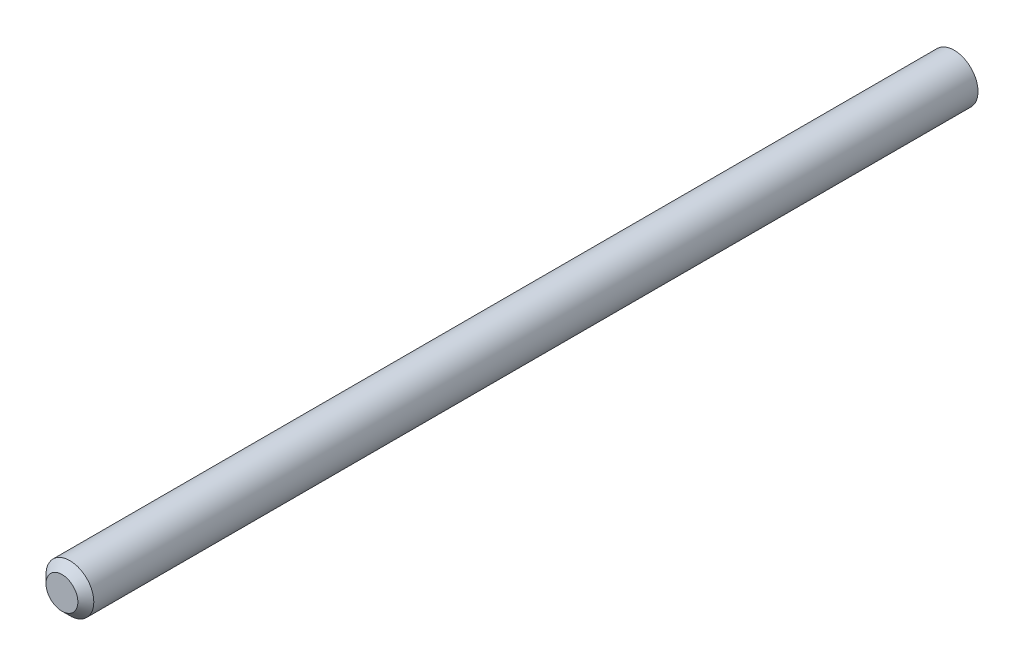
ISO-10303-21;
HEADER;
FILE_DESCRIPTION(('STEP AP214'),'2;1');
FILE_NAME('part.step','',(''),(''),'','','');
FILE_SCHEMA(('AUTOMOTIVE_DESIGN { 1 0 10303 214 1 1 1 1 }'));
ENDSEC;
DATA;
#1=APPLICATION_CONTEXT('core data for automotive mechanical design processes');
#2=APPLICATION_PROTOCOL_DEFINITION('international standard','automotive_design',2000,#1);
#3=PRODUCT_CONTEXT('',#1,'mechanical');
#4=PRODUCT('Part','Part','',(#3));
#5=PRODUCT_RELATED_PRODUCT_CATEGORY('part','',(#4));
#6=PRODUCT_DEFINITION_FORMATION('','',#4);
#7=PRODUCT_DEFINITION_CONTEXT('part definition',#1,'design');
#8=PRODUCT_DEFINITION('design','',#6,#7);
#9=PRODUCT_DEFINITION_SHAPE('','',#8);
#10=(LENGTH_UNIT() NAMED_UNIT(*) SI_UNIT(.MILLI.,.METRE.));
#11=(NAMED_UNIT(*) PLANE_ANGLE_UNIT() SI_UNIT($,.RADIAN.));
#12=(NAMED_UNIT(*) SI_UNIT($,.STERADIAN.) SOLID_ANGLE_UNIT());
#13=UNCERTAINTY_MEASURE_WITH_UNIT(LENGTH_MEASURE(1.E-05),#10,'distance_accuracy_value','');
#14=(GEOMETRIC_REPRESENTATION_CONTEXT(3) GLOBAL_UNCERTAINTY_ASSIGNED_CONTEXT((#13)) GLOBAL_UNIT_ASSIGNED_CONTEXT((#10,
#11,#12)) REPRESENTATION_CONTEXT('',''));
#15=CARTESIAN_POINT('',(0.,0.,0.));
#16=DIRECTION('',(0.,0.,1.));
#17=DIRECTION('',(1.,0.,0.));
#18=AXIS2_PLACEMENT_3D('',#15,#16,#17);
#19=CARTESIAN_POINT('',(0.,0.,355.6));
#20=DIRECTION('',(0.,0.,-1.));
#21=DIRECTION('',(-1.,0.,0.));
#22=AXIS2_PLACEMENT_3D('',#19,#20,#21);
#23=CYLINDRICAL_SURFACE('',#22,9.525);
#24=CARTESIAN_POINT('',(0.,0.,352.425));
#25=DIRECTION('',(0.,0.,1.));
#26=DIRECTION('',(1.,0.,0.));
#27=AXIS2_PLACEMENT_3D('',#24,#25,#26);
#28=CIRCLE('',#27,9.525);
#29=CARTESIAN_POINT('',(9.525,0.,352.425));
#30=VERTEX_POINT('',#29);
#31=EDGE_CURVE('E10',#30,#30,#28,.F.);
#32=ORIENTED_EDGE('',*,*,#31,.T.);
#33=EDGE_LOOP('',(#32));
#34=FACE_BOUND('',#33,.T.);
#35=CARTESIAN_POINT('',(0.,0.,0.));
#36=DIRECTION('',(0.,0.,1.));
#37=DIRECTION('',(1.,0.,0.));
#38=AXIS2_PLACEMENT_3D('',#35,#36,#37);
#39=CIRCLE('',#38,9.525);
#40=CARTESIAN_POINT('',(9.525,0.,0.));
#41=VERTEX_POINT('',#40);
#42=EDGE_CURVE('E44',#41,#41,#39,.T.);
#43=ORIENTED_EDGE('',*,*,#42,.T.);
#44=EDGE_LOOP('',(#43));
#45=FACE_BOUND('',#44,.T.);
#46=ADVANCED_FACE('F32',(#34,#45),#23,.T.);
#47=CARTESIAN_POINT('',(0.,0.,355.6));
#48=DIRECTION('',(0.,0.,1.));
#49=DIRECTION('',(1.,0.,0.));
#50=AXIS2_PLACEMENT_3D('',#47,#48,#49);
#51=PLANE('',#50);
#52=CARTESIAN_POINT('',(0.,0.,355.6));
#53=DIRECTION('',(0.,0.,1.));
#54=DIRECTION('',(1.,0.,0.));
#55=AXIS2_PLACEMENT_3D('',#52,#53,#54);
#56=CIRCLE('',#55,6.35000000000002);
#57=CARTESIAN_POINT('',(6.35000000000002,0.,355.6));
#58=VERTEX_POINT('',#57);
#59=EDGE_CURVE('E40',#58,#58,#56,.T.);
#60=ORIENTED_EDGE('',*,*,#59,.T.);
#61=EDGE_LOOP('',(#60));
#62=FACE_BOUND('',#61,.T.);
#63=ADVANCED_FACE('F54',(#62),#51,.T.);
#64=CARTESIAN_POINT('',(0.,0.,0.));
#65=DIRECTION('',(0.,0.,1.));
#66=DIRECTION('',(1.,0.,0.));
#67=AXIS2_PLACEMENT_3D('',#64,#65,#66);
#68=PLANE('',#67);
#69=ORIENTED_EDGE('',*,*,#42,.F.);
#70=EDGE_LOOP('',(#69));
#71=FACE_BOUND('',#70,.T.);
#72=ADVANCED_FACE('F52',(#71),#68,.F.);
#73=CARTESIAN_POINT('',(0.,0.,355.6));
#74=DIRECTION('',(0.,0.,-1.));
#75=DIRECTION('',(-1.,0.,0.));
#76=AXIS2_PLACEMENT_3D('',#73,#74,#75);
#77=CONICAL_SURFACE('',#76,6.35000000000002,0.785398163397456);
#78=ORIENTED_EDGE('',*,*,#31,.F.);
#79=EDGE_LOOP('',(#78));
#80=FACE_BOUND('',#79,.T.);
#81=ORIENTED_EDGE('',*,*,#59,.F.);
#82=EDGE_LOOP('',(#81));
#83=FACE_BOUND('',#82,.T.);
#84=ADVANCED_FACE('F35',(#80,#83),#77,.T.);
#85=CLOSED_SHELL('',(#46,#63,#72,#84));
#86=MANIFOLD_SOLID_BREP('B2',#85);
#87=ADVANCED_BREP_SHAPE_REPRESENTATION('',(#18,#86),#14);
#88=SHAPE_DEFINITION_REPRESENTATION(#9,#87);
ENDSEC;
END-ISO-10303-21;
